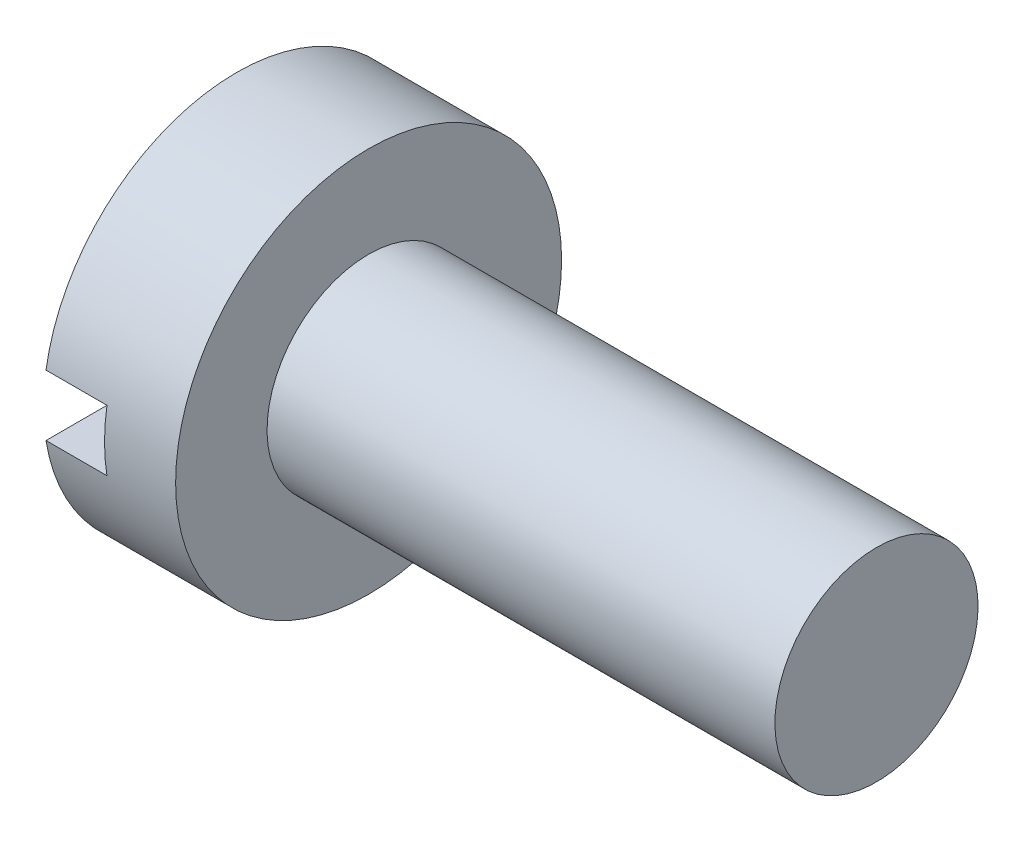
ISO-10303-21;
HEADER;
FILE_DESCRIPTION(('STEP AP214'),'2;1');
FILE_NAME('part.step','',(''),(''),'','','');
FILE_SCHEMA(('AUTOMOTIVE_DESIGN { 1 0 10303 214 1 1 1 1 }'));
ENDSEC;
DATA;
#1=APPLICATION_CONTEXT('core data for automotive mechanical design processes');
#2=APPLICATION_PROTOCOL_DEFINITION('international standard','automotive_design',2000,#1);
#3=PRODUCT_CONTEXT('',#1,'mechanical');
#4=PRODUCT('Part','Part','',(#3));
#5=PRODUCT_RELATED_PRODUCT_CATEGORY('part','',(#4));
#6=PRODUCT_DEFINITION_FORMATION('','',#4);
#7=PRODUCT_DEFINITION_CONTEXT('part definition',#1,'design');
#8=PRODUCT_DEFINITION('design','',#6,#7);
#9=PRODUCT_DEFINITION_SHAPE('','',#8);
#10=(LENGTH_UNIT() NAMED_UNIT(*) SI_UNIT(.MILLI.,.METRE.));
#11=(NAMED_UNIT(*) PLANE_ANGLE_UNIT() SI_UNIT($,.RADIAN.));
#12=(NAMED_UNIT(*) SI_UNIT($,.STERADIAN.) SOLID_ANGLE_UNIT());
#13=UNCERTAINTY_MEASURE_WITH_UNIT(LENGTH_MEASURE(1.E-05),#10,'distance_accuracy_value','');
#14=(GEOMETRIC_REPRESENTATION_CONTEXT(3) GLOBAL_UNCERTAINTY_ASSIGNED_CONTEXT((#13)) GLOBAL_UNIT_ASSIGNED_CONTEXT((#10,
#11,#12)) REPRESENTATION_CONTEXT('',''));
#15=CARTESIAN_POINT('',(0.,0.,0.));
#16=DIRECTION('',(0.,0.,1.));
#17=DIRECTION('',(1.,0.,0.));
#18=AXIS2_PLACEMENT_3D('',#15,#16,#17);
#19=CARTESIAN_POINT('',(0.,0.,0.));
#20=DIRECTION('',(-1.,0.,0.));
#21=DIRECTION('',(0.,-1.,0.));
#22=AXIS2_PLACEMENT_3D('',#19,#20,#21);
#23=PLANE('',#22);
#24=DIRECTION('',(0.,0.,-1.));
#25=VECTOR('',#24,1.);
#26=CARTESIAN_POINT('',(0.,0.299999999999998,-1.9));
#27=LINE('',#26,#25);
#28=CARTESIAN_POINT('',(0.,0.299999999999999,1.87616630392937));
#29=VERTEX_POINT('',#28);
#30=CARTESIAN_POINT('',(0.,0.299999999999998,-1.87616630392937));
#31=VERTEX_POINT('',#30);
#32=EDGE_CURVE('E82',#29,#31,#27,.T.);
#33=ORIENTED_EDGE('',*,*,#32,.F.);
#34=CARTESIAN_POINT('',(0.,0.,0.));
#35=DIRECTION('',(1.,0.,0.));
#36=DIRECTION('',(0.,1.,0.));
#37=AXIS2_PLACEMENT_3D('',#34,#35,#36);
#38=CIRCLE('',#37,1.9);
#39=EDGE_CURVE('E88',#31,#29,#38,.T.);
#40=ORIENTED_EDGE('',*,*,#39,.F.);
#41=EDGE_LOOP('',(#33,#40));
#42=FACE_BOUND('',#41,.T.);
#43=ADVANCED_FACE('F32',(#42),#23,.T.);
#44=DIRECTION('',(0.,0.,1.));
#45=VECTOR('',#44,1.);
#46=CARTESIAN_POINT('',(0.,-0.3,-1.9));
#47=LINE('',#46,#45);
#48=CARTESIAN_POINT('',(0.,-0.3,-1.87616630392937));
#49=VERTEX_POINT('',#48);
#50=CARTESIAN_POINT('',(0.,-0.299999999999999,1.87616630392937));
#51=VERTEX_POINT('',#50);
#52=EDGE_CURVE('E76',#49,#51,#47,.T.);
#53=ORIENTED_EDGE('',*,*,#52,.F.);
#54=EDGE_CURVE('E81',#51,#49,#38,.T.);
#55=ORIENTED_EDGE('',*,*,#54,.F.);
#56=EDGE_LOOP('',(#53,#55));
#57=FACE_BOUND('',#56,.T.);
#58=ADVANCED_FACE('F34',(#57),#23,.T.);
#59=CARTESIAN_POINT('',(6.3,0.,0.));
#60=DIRECTION('',(1.,0.,0.));
#61=DIRECTION('',(0.,1.,0.));
#62=AXIS2_PLACEMENT_3D('',#59,#60,#61);
#63=CYLINDRICAL_SURFACE('',#62,1.9);
#64=DIRECTION('',(1.,0.,0.));
#65=VECTOR('',#64,1.);
#66=CARTESIAN_POINT('',(6.3,0.299999999999998,-1.87616630392937));
#67=LINE('',#66,#65);
#68=CARTESIAN_POINT('',(0.6,0.299999999999998,-1.87616630392937));
#69=VERTEX_POINT('',#68);
#70=EDGE_CURVE('E11',#31,#69,#67,.T.);
#71=ORIENTED_EDGE('',*,*,#70,.F.);
#72=ORIENTED_EDGE('',*,*,#39,.T.);
#73=DIRECTION('',(1.,0.,0.));
#74=VECTOR('',#73,1.);
#75=CARTESIAN_POINT('',(6.3,0.299999999999999,1.87616630392937));
#76=LINE('',#75,#74);
#77=CARTESIAN_POINT('',(0.6,0.299999999999999,1.87616630392937));
#78=VERTEX_POINT('',#77);
#79=EDGE_CURVE('E97',#78,#29,#76,.F.);
#80=ORIENTED_EDGE('',*,*,#79,.F.);
#81=CARTESIAN_POINT('',(0.6,0.,0.));
#82=DIRECTION('',(-1.,0.,0.));
#83=DIRECTION('',(0.,0.,1.));
#84=AXIS2_PLACEMENT_3D('',#81,#82,#83);
#85=CIRCLE('',#84,1.9);
#86=CARTESIAN_POINT('',(0.6,-0.299999999999999,1.87616630392937));
#87=VERTEX_POINT('',#86);
#88=EDGE_CURVE('E47',#78,#87,#85,.F.);
#89=ORIENTED_EDGE('',*,*,#88,.T.);
#90=DIRECTION('',(1.,0.,0.));
#91=VECTOR('',#90,1.);
#92=CARTESIAN_POINT('',(6.3,-0.299999999999999,1.87616630392937));
#93=LINE('',#92,#91);
#94=EDGE_CURVE('E87',#51,#87,#93,.T.);
#95=ORIENTED_EDGE('',*,*,#94,.F.);
#96=ORIENTED_EDGE('',*,*,#54,.T.);
#97=DIRECTION('',(1.,0.,0.));
#98=VECTOR('',#97,1.);
#99=CARTESIAN_POINT('',(6.3,-0.3,-1.87616630392937));
#100=LINE('',#99,#98);
#101=CARTESIAN_POINT('',(0.6,-0.3,-1.87616630392937));
#102=VERTEX_POINT('',#101);
#103=EDGE_CURVE('E40',#102,#49,#100,.F.);
#104=ORIENTED_EDGE('',*,*,#103,.F.);
#105=EDGE_CURVE('E55',#102,#69,#85,.F.);
#106=ORIENTED_EDGE('',*,*,#105,.T.);
#107=EDGE_LOOP('',(#71,#72,#80,#89,#95,#96,#104,#106));
#108=FACE_BOUND('',#107,.T.);
#109=CARTESIAN_POINT('',(1.3,0.,0.));
#110=DIRECTION('',(1.,0.,0.));
#111=DIRECTION('',(0.,1.,0.));
#112=AXIS2_PLACEMENT_3D('',#109,#110,#111);
#113=CIRCLE('',#112,1.9);
#114=CARTESIAN_POINT('',(1.3,1.9,0.));
#115=VERTEX_POINT('',#114);
#116=EDGE_CURVE('E92',#115,#115,#113,.T.);
#117=ORIENTED_EDGE('',*,*,#116,.F.);
#118=EDGE_LOOP('',(#117));
#119=FACE_BOUND('',#118,.T.);
#120=ADVANCED_FACE('F85',(#108,#119),#63,.T.);
#121=CARTESIAN_POINT('',(1.3,1.9,0.));
#122=DIRECTION('',(1.,0.,0.));
#123=DIRECTION('',(0.,1.,0.));
#124=AXIS2_PLACEMENT_3D('',#121,#122,#123);
#125=PLANE('',#124);
#126=ORIENTED_EDGE('',*,*,#116,.T.);
#127=EDGE_LOOP('',(#126));
#128=FACE_BOUND('',#127,.T.);
#129=CARTESIAN_POINT('',(1.3,0.,0.));
#130=DIRECTION('',(1.,0.,0.));
#131=DIRECTION('',(0.,1.,0.));
#132=AXIS2_PLACEMENT_3D('',#129,#130,#131);
#133=CIRCLE('',#132,0.999999999999999);
#134=CARTESIAN_POINT('',(1.3,1.,0.));
#135=VERTEX_POINT('',#134);
#136=EDGE_CURVE('E110',#135,#135,#133,.T.);
#137=ORIENTED_EDGE('',*,*,#136,.F.);
#138=EDGE_LOOP('',(#137));
#139=FACE_BOUND('',#138,.T.);
#140=ADVANCED_FACE('F117',(#128,#139),#125,.T.);
#141=CARTESIAN_POINT('',(6.3,0.,0.));
#142=DIRECTION('',(1.,0.,0.));
#143=DIRECTION('',(0.,1.,0.));
#144=AXIS2_PLACEMENT_3D('',#141,#142,#143);
#145=CYLINDRICAL_SURFACE('',#144,0.999999999999999);
#146=ORIENTED_EDGE('',*,*,#136,.T.);
#147=EDGE_LOOP('',(#146));
#148=FACE_BOUND('',#147,.T.);
#149=CARTESIAN_POINT('',(6.3,0.,0.));
#150=DIRECTION('',(1.,0.,0.));
#151=DIRECTION('',(0.,1.,0.));
#152=AXIS2_PLACEMENT_3D('',#149,#150,#151);
#153=CIRCLE('',#152,0.999999999999999);
#154=CARTESIAN_POINT('',(6.3,0.999999999999999,0.));
#155=VERTEX_POINT('',#154);
#156=EDGE_CURVE('E108',#155,#155,#153,.T.);
#157=ORIENTED_EDGE('',*,*,#156,.F.);
#158=EDGE_LOOP('',(#157));
#159=FACE_BOUND('',#158,.T.);
#160=ADVANCED_FACE('F124',(#148,#159),#145,.T.);
#161=CARTESIAN_POINT('',(6.3,0.999999999999999,0.));
#162=DIRECTION('',(1.,0.,0.));
#163=DIRECTION('',(0.,1.,0.));
#164=AXIS2_PLACEMENT_3D('',#161,#162,#163);
#165=PLANE('',#164);
#166=ORIENTED_EDGE('',*,*,#156,.T.);
#167=EDGE_LOOP('',(#166));
#168=FACE_BOUND('',#167,.T.);
#169=ADVANCED_FACE('F149',(#168),#165,.T.);
#170=CARTESIAN_POINT('',(0.6,0.299999999999998,-1.9));
#171=DIRECTION('',(0.,1.,0.));
#172=DIRECTION('',(0.,0.,1.));
#173=AXIS2_PLACEMENT_3D('',#170,#171,#172);
#174=PLANE('',#173);
#175=ORIENTED_EDGE('',*,*,#79,.T.);
#176=ORIENTED_EDGE('',*,*,#32,.T.);
#177=ORIENTED_EDGE('',*,*,#70,.T.);
#178=DIRECTION('',(0.,0.,-1.));
#179=VECTOR('',#178,1.);
#180=CARTESIAN_POINT('',(0.6,0.299999999999998,-1.9));
#181=LINE('',#180,#179);
#182=EDGE_CURVE('E104',#78,#69,#181,.T.);
#183=ORIENTED_EDGE('',*,*,#182,.F.);
#184=EDGE_LOOP('',(#175,#176,#177,#183));
#185=FACE_BOUND('',#184,.T.);
#186=ADVANCED_FACE('F144',(#185),#174,.F.);
#187=CARTESIAN_POINT('',(0.6,-0.3,-1.9));
#188=DIRECTION('',(0.,-1.,0.));
#189=DIRECTION('',(0.,0.,-1.));
#190=AXIS2_PLACEMENT_3D('',#187,#188,#189);
#191=PLANE('',#190);
#192=ORIENTED_EDGE('',*,*,#103,.T.);
#193=ORIENTED_EDGE('',*,*,#52,.T.);
#194=ORIENTED_EDGE('',*,*,#94,.T.);
#195=DIRECTION('',(0.,0.,1.));
#196=VECTOR('',#195,1.);
#197=CARTESIAN_POINT('',(0.6,-0.3,-1.9));
#198=LINE('',#197,#196);
#199=EDGE_CURVE('E77',#102,#87,#198,.T.);
#200=ORIENTED_EDGE('',*,*,#199,.F.);
#201=EDGE_LOOP('',(#192,#193,#194,#200));
#202=FACE_BOUND('',#201,.T.);
#203=ADVANCED_FACE('F75',(#202),#191,.F.);
#204=CARTESIAN_POINT('',(0.6,0.,0.));
#205=DIRECTION('',(-1.,0.,0.));
#206=DIRECTION('',(0.,0.,1.));
#207=AXIS2_PLACEMENT_3D('',#204,#205,#206);
#208=PLANE('',#207);
#209=ORIENTED_EDGE('',*,*,#199,.T.);
#210=ORIENTED_EDGE('',*,*,#88,.F.);
#211=ORIENTED_EDGE('',*,*,#182,.T.);
#212=ORIENTED_EDGE('',*,*,#105,.F.);
#213=EDGE_LOOP('',(#209,#210,#211,#212));
#214=FACE_BOUND('',#213,.T.);
#215=ADVANCED_FACE('F159',(#214),#208,.T.);
#216=CLOSED_SHELL('',(#43,#58,#120,#140,#160,#169,#186,#203,#215));
#217=MANIFOLD_SOLID_BREP('B2',#216);
#218=ADVANCED_BREP_SHAPE_REPRESENTATION('',(#18,#217),#14);
#219=SHAPE_DEFINITION_REPRESENTATION(#9,#218);
ENDSEC;
END-ISO-10303-21;
